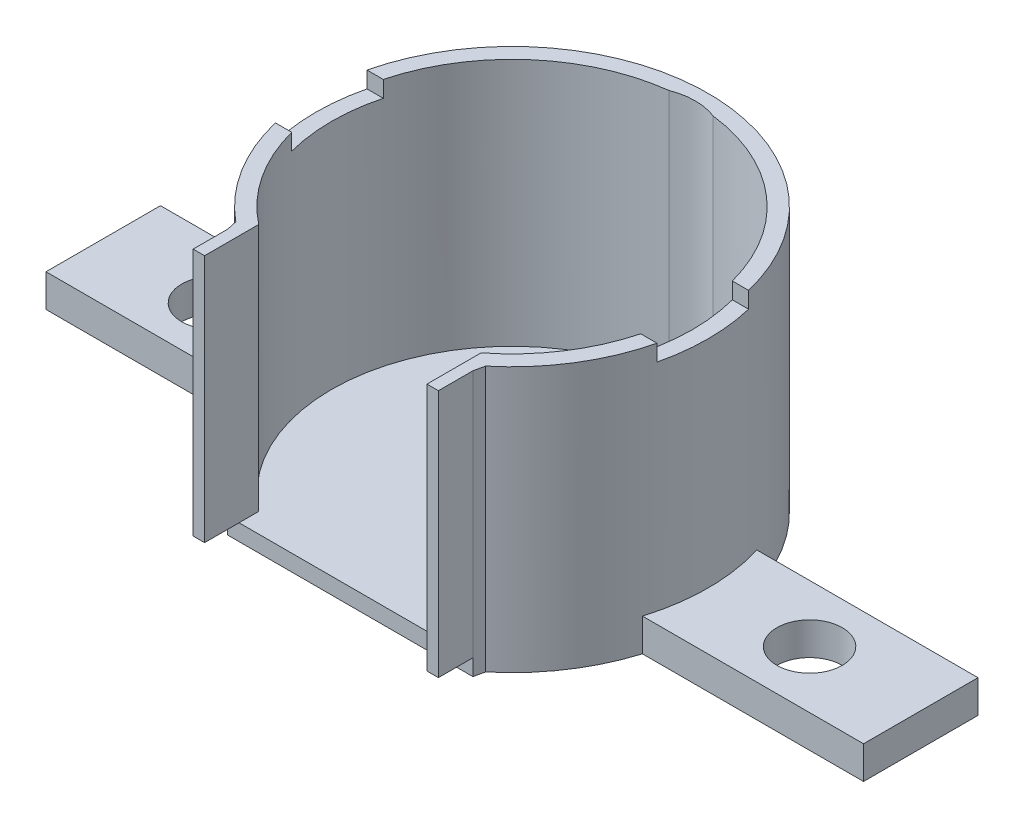
ISO-10303-21;
HEADER;
FILE_DESCRIPTION(('STEP AP214'),'2;1');
FILE_NAME('part.step','',(''),(''),'','','');
FILE_SCHEMA(('AUTOMOTIVE_DESIGN { 1 0 10303 214 1 1 1 1 }'));
ENDSEC;
DATA;
#1=APPLICATION_CONTEXT('core data for automotive mechanical design processes');
#2=APPLICATION_PROTOCOL_DEFINITION('international standard','automotive_design',2000,#1);
#3=PRODUCT_CONTEXT('',#1,'mechanical');
#4=PRODUCT('Part','Part','',(#3));
#5=PRODUCT_RELATED_PRODUCT_CATEGORY('part','',(#4));
#6=PRODUCT_DEFINITION_FORMATION('','',#4);
#7=PRODUCT_DEFINITION_CONTEXT('part definition',#1,'design');
#8=PRODUCT_DEFINITION('design','',#6,#7);
#9=PRODUCT_DEFINITION_SHAPE('','',#8);
#10=(LENGTH_UNIT() NAMED_UNIT(*) SI_UNIT(.MILLI.,.METRE.));
#11=(NAMED_UNIT(*) PLANE_ANGLE_UNIT() SI_UNIT($,.RADIAN.));
#12=(NAMED_UNIT(*) SI_UNIT($,.STERADIAN.) SOLID_ANGLE_UNIT());
#13=UNCERTAINTY_MEASURE_WITH_UNIT(LENGTH_MEASURE(1.E-05),#10,'distance_accuracy_value','');
#14=(GEOMETRIC_REPRESENTATION_CONTEXT(3) GLOBAL_UNCERTAINTY_ASSIGNED_CONTEXT((#13)) GLOBAL_UNIT_ASSIGNED_CONTEXT((#10,
#11,#12)) REPRESENTATION_CONTEXT('',''));
#15=CARTESIAN_POINT('',(0.,0.,0.));
#16=DIRECTION('',(0.,0.,1.));
#17=DIRECTION('',(1.,0.,0.));
#18=AXIS2_PLACEMENT_3D('',#15,#16,#17);
#19=CARTESIAN_POINT('',(0.,19.304,0.));
#20=DIRECTION('',(0.,1.,0.));
#21=DIRECTION('',(0.,0.,1.));
#22=AXIS2_PLACEMENT_3D('',#19,#20,#21);
#23=PLANE('',#22);
#24=DIRECTION('',(1.,0.,0.));
#25=VECTOR('',#24,1.);
#26=CARTESIAN_POINT('',(13.5255,19.304,3.556));
#27=LINE('',#26,#25);
#28=CARTESIAN_POINT('',(13.5557984937258,19.304,3.556));
#29=VERTEX_POINT('',#28);
#30=CARTESIAN_POINT('',(14.8193273801479,19.304,3.556));
#31=VERTEX_POINT('',#30);
#32=EDGE_CURVE('E398',#29,#31,#27,.T.);
#33=ORIENTED_EDGE('',*,*,#32,.F.);
#34=CARTESIAN_POINT('',(0.,19.304,0.));
#35=DIRECTION('',(0.,1.,0.));
#36=DIRECTION('',(0.,0.,1.));
#37=AXIS2_PLACEMENT_3D('',#34,#35,#36);
#38=CIRCLE('',#37,14.01445);
#39=CARTESIAN_POINT('',(8.63599999999999,19.304,11.0374051661838));
#40=VERTEX_POINT('',#39);
#41=EDGE_CURVE('E325',#40,#29,#38,.T.);
#42=ORIENTED_EDGE('',*,*,#41,.F.);
#43=DIRECTION('',(0.,0.,-1.));
#44=VECTOR('',#43,1.);
#45=CARTESIAN_POINT('',(8.636,19.304,15.2409378327274));
#46=LINE('',#45,#44);
#47=CARTESIAN_POINT('',(8.636,19.304,15.2409378327274));
#48=VERTEX_POINT('',#47);
#49=EDGE_CURVE('E570',#48,#40,#46,.T.);
#50=ORIENTED_EDGE('',*,*,#49,.F.);
#51=DIRECTION('',(1.,0.,0.));
#52=VECTOR('',#51,1.);
#53=CARTESIAN_POINT('',(-9.525,19.304,15.2409378327274));
#54=LINE('',#53,#52);
#55=CARTESIAN_POINT('',(9.525,19.304,15.2409378327274));
#56=VERTEX_POINT('',#55);
#57=EDGE_CURVE('E740',#48,#56,#54,.T.);
#58=ORIENTED_EDGE('',*,*,#57,.T.);
#59=DIRECTION('',(0.,0.,-1.));
#60=VECTOR('',#59,1.);
#61=CARTESIAN_POINT('',(9.525,19.304,15.2409378327274));
#62=LINE('',#61,#60);
#63=CARTESIAN_POINT('',(9.525,19.304,12.5631800169447));
#64=VERTEX_POINT('',#63);
#65=EDGE_CURVE('E742',#56,#64,#62,.T.);
#66=ORIENTED_EDGE('',*,*,#65,.T.);
#67=DIRECTION('',(0.213179274775089,0.,-0.977013099608376));
#68=VECTOR('',#67,1.);
#69=CARTESIAN_POINT('',(9.525,19.304,12.5631800169447));
#70=LINE('',#69,#68);
#71=CARTESIAN_POINT('',(9.70177588828793,19.304,11.75300576931));
#72=VERTEX_POINT('',#71);
#73=EDGE_CURVE('E736',#64,#72,#70,.T.);
#74=ORIENTED_EDGE('',*,*,#73,.T.);
#75=CARTESIAN_POINT('',(0.,19.304,0.));
#76=DIRECTION('',(0.,1.,0.));
#77=DIRECTION('',(0.,0.,1.));
#78=AXIS2_PLACEMENT_3D('',#75,#76,#77);
#79=CIRCLE('',#78,15.24);
#80=EDGE_CURVE('E340',#72,#31,#79,.T.);
#81=ORIENTED_EDGE('',*,*,#80,.T.);
#82=EDGE_LOOP('',(#33,#42,#50,#58,#66,#74,#81));
#83=FACE_BOUND('',#82,.T.);
#84=ADVANCED_FACE('F93',(#83),#23,.T.);
#85=DIRECTION('',(1.,0.,0.));
#86=VECTOR('',#85,1.);
#87=CARTESIAN_POINT('',(-13.5255,19.304,3.556));
#88=LINE('',#87,#86);
#89=CARTESIAN_POINT('',(-14.8193273801479,19.304,3.556));
#90=VERTEX_POINT('',#89);
#91=CARTESIAN_POINT('',(-13.5557984937258,19.304,3.556));
#92=VERTEX_POINT('',#91);
#93=EDGE_CURVE('E313',#90,#92,#88,.T.);
#94=ORIENTED_EDGE('',*,*,#93,.F.);
#95=CARTESIAN_POINT('',(-9.70177588828793,19.304,11.75300576931));
#96=VERTEX_POINT('',#95);
#97=EDGE_CURVE('E333',#90,#96,#79,.T.);
#98=ORIENTED_EDGE('',*,*,#97,.T.);
#99=DIRECTION('',(-0.213179274775089,0.,-0.977013099608376));
#100=VECTOR('',#99,1.);
#101=CARTESIAN_POINT('',(-9.525,19.304,12.5631800169447));
#102=LINE('',#101,#100);
#103=CARTESIAN_POINT('',(-9.525,19.304,12.5631800169447));
#104=VERTEX_POINT('',#103);
#105=EDGE_CURVE('E730',#104,#96,#102,.T.);
#106=ORIENTED_EDGE('',*,*,#105,.F.);
#107=DIRECTION('',(0.,0.,1.));
#108=VECTOR('',#107,1.);
#109=CARTESIAN_POINT('',(-9.525,19.304,12.5631800169447));
#110=LINE('',#109,#108);
#111=CARTESIAN_POINT('',(-9.525,19.304,15.2409378327274));
#112=VERTEX_POINT('',#111);
#113=EDGE_CURVE('E735',#104,#112,#110,.T.);
#114=ORIENTED_EDGE('',*,*,#113,.T.);
#115=CARTESIAN_POINT('',(-8.636,19.304,15.2409378327274));
#116=VERTEX_POINT('',#115);
#117=EDGE_CURVE('E745',#112,#116,#54,.T.);
#118=ORIENTED_EDGE('',*,*,#117,.T.);
#119=DIRECTION('',(0.,0.,1.));
#120=VECTOR('',#119,1.);
#121=CARTESIAN_POINT('',(-8.636,19.304,14.01445));
#122=LINE('',#121,#120);
#123=CARTESIAN_POINT('',(-8.636,19.304,11.0374051661838));
#124=VERTEX_POINT('',#123);
#125=EDGE_CURVE('E556',#124,#116,#122,.T.);
#126=ORIENTED_EDGE('',*,*,#125,.F.);
#127=EDGE_CURVE('E323',#92,#124,#38,.T.);
#128=ORIENTED_EDGE('',*,*,#127,.F.);
#129=EDGE_LOOP('',(#94,#98,#106,#114,#118,#126,#128));
#130=FACE_BOUND('',#129,.T.);
#131=ADVANCED_FACE('F640',(#130),#23,.T.);
#132=CARTESIAN_POINT('',(0.,19.304,0.));
#133=DIRECTION('',(0.,-1.,0.));
#134=DIRECTION('',(0.,0.,-1.));
#135=AXIS2_PLACEMENT_3D('',#132,#133,#134);
#136=CYLINDRICAL_SURFACE('',#135,14.01445);
#137=DIRECTION('',(0.,-1.,0.));
#138=VECTOR('',#137,1.);
#139=CARTESIAN_POINT('',(13.5557984937258,19.304,3.556));
#140=LINE('',#139,#138);
#141=CARTESIAN_POINT('',(13.5557984937258,18.034,3.556));
#142=VERTEX_POINT('',#141);
#143=EDGE_CURVE('E423',#142,#29,#140,.F.);
#144=ORIENTED_EDGE('',*,*,#143,.F.);
#145=CARTESIAN_POINT('',(0.,18.034,0.));
#146=DIRECTION('',(0.,-1.,0.));
#147=DIRECTION('',(0.,0.,-1.));
#148=AXIS2_PLACEMENT_3D('',#145,#146,#147);
#149=CIRCLE('',#148,14.01445);
#150=CARTESIAN_POINT('',(13.5557984937258,18.034,-3.556));
#151=VERTEX_POINT('',#150);
#152=EDGE_CURVE('E417',#151,#142,#149,.T.);
#153=ORIENTED_EDGE('',*,*,#152,.F.);
#154=DIRECTION('',(0.,-1.,0.));
#155=VECTOR('',#154,1.);
#156=CARTESIAN_POINT('',(13.5557984937258,19.304,-3.556));
#157=LINE('',#156,#155);
#158=CARTESIAN_POINT('',(13.5557984937258,19.304,-3.556));
#159=VERTEX_POINT('',#158);
#160=EDGE_CURVE('E420',#159,#151,#157,.T.);
#161=ORIENTED_EDGE('',*,*,#160,.F.);
#162=CARTESIAN_POINT('',(1.7170769342723,19.304,-13.9088624841965));
#163=VERTEX_POINT('',#162);
#164=EDGE_CURVE('E322',#159,#163,#38,.T.);
#165=ORIENTED_EDGE('',*,*,#164,.T.);
#166=DIRECTION('',(0.,-1.,0.));
#167=VECTOR('',#166,1.);
#168=CARTESIAN_POINT('',(1.71707693427231,9.652,-13.9088624841965));
#169=LINE('',#168,#167);
#170=CARTESIAN_POINT('',(1.71707693427231,0.,-13.9088624841965));
#171=VERTEX_POINT('',#170);
#172=EDGE_CURVE('E522',#171,#163,#169,.F.);
#173=ORIENTED_EDGE('',*,*,#172,.F.);
#174=CARTESIAN_POINT('',(0.,0.,0.));
#175=DIRECTION('',(0.,1.,0.));
#176=DIRECTION('',(0.,0.,1.));
#177=AXIS2_PLACEMENT_3D('',#174,#175,#176);
#178=CIRCLE('',#177,14.01445);
#179=CARTESIAN_POINT('',(8.63599999999999,0.,11.0374051661838));
#180=VERTEX_POINT('',#179);
#181=EDGE_CURVE('E328',#180,#171,#178,.T.);
#182=ORIENTED_EDGE('',*,*,#181,.F.);
#183=DIRECTION('',(0.,1.,0.));
#184=VECTOR('',#183,1.);
#185=CARTESIAN_POINT('',(8.63599999999999,0.,11.0374051661838));
#186=LINE('',#185,#184);
#187=EDGE_CURVE('E567',#180,#40,#186,.T.);
#188=ORIENTED_EDGE('',*,*,#187,.T.);
#189=ORIENTED_EDGE('',*,*,#41,.T.);
#190=EDGE_LOOP('',(#144,#153,#161,#165,#173,#182,#188,#189));
#191=FACE_BOUND('',#190,.T.);
#192=ADVANCED_FACE('F586',(#191),#136,.F.);
#193=CARTESIAN_POINT('',(0.,0.,0.));
#194=DIRECTION('',(0.,1.,0.));
#195=DIRECTION('',(0.,0.,1.));
#196=AXIS2_PLACEMENT_3D('',#193,#194,#195);
#197=PLANE('',#196);
#198=DIRECTION('',(-1.,0.,0.));
#199=VECTOR('',#198,1.);
#200=CARTESIAN_POINT('',(-9.525,0.,12.5631800169447));
#201=LINE('',#200,#199);
#202=CARTESIAN_POINT('',(9.525,0.,12.5631800169447));
#203=VERTEX_POINT('',#202);
#204=CARTESIAN_POINT('',(8.636,0.,12.5631800169447));
#205=VERTEX_POINT('',#204);
#206=EDGE_CURVE('E532',#203,#205,#201,.T.);
#207=ORIENTED_EDGE('',*,*,#206,.F.);
#208=DIRECTION('',(0.,0.,-1.));
#209=VECTOR('',#208,1.);
#210=CARTESIAN_POINT('',(9.525,0.,15.2409378327274));
#211=LINE('',#210,#209);
#212=CARTESIAN_POINT('',(9.525,0.,15.2409378327274));
#213=VERTEX_POINT('',#212);
#214=EDGE_CURVE('E576',#213,#203,#211,.T.);
#215=ORIENTED_EDGE('',*,*,#214,.F.);
#216=DIRECTION('',(1.,0.,0.));
#217=VECTOR('',#216,1.);
#218=CARTESIAN_POINT('',(-9.525,0.,15.2409378327274));
#219=LINE('',#218,#217);
#220=CARTESIAN_POINT('',(8.63599999999999,0.,15.2409378327274));
#221=VERTEX_POINT('',#220);
#222=EDGE_CURVE('E756',#221,#213,#219,.T.);
#223=ORIENTED_EDGE('',*,*,#222,.F.);
#224=DIRECTION('',(0.,0.,-1.));
#225=VECTOR('',#224,1.);
#226=CARTESIAN_POINT('',(8.636,0.,11.0374051661838));
#227=LINE('',#226,#225);
#228=EDGE_CURVE('E557',#221,#205,#227,.T.);
#229=ORIENTED_EDGE('',*,*,#228,.T.);
#230=EDGE_LOOP('',(#207,#215,#223,#229));
#231=FACE_BOUND('',#230,.T.);
#232=ADVANCED_FACE('F664',(#231),#197,.F.);
#233=CARTESIAN_POINT('',(-8.636,0.,12.5631800169447));
#234=VERTEX_POINT('',#233);
#235=CARTESIAN_POINT('',(-9.525,0.,12.5631800169447));
#236=VERTEX_POINT('',#235);
#237=EDGE_CURVE('E362',#234,#236,#201,.T.);
#238=ORIENTED_EDGE('',*,*,#237,.F.);
#239=DIRECTION('',(0.,0.,1.));
#240=VECTOR('',#239,1.);
#241=CARTESIAN_POINT('',(-8.636,0.,11.0374051661838));
#242=LINE('',#241,#240);
#243=CARTESIAN_POINT('',(-8.636,0.,15.2409378327274));
#244=VERTEX_POINT('',#243);
#245=EDGE_CURVE('E561',#234,#244,#242,.T.);
#246=ORIENTED_EDGE('',*,*,#245,.T.);
#247=CARTESIAN_POINT('',(-9.525,0.,15.2409378327274));
#248=VERTEX_POINT('',#247);
#249=EDGE_CURVE('E757',#248,#244,#219,.T.);
#250=ORIENTED_EDGE('',*,*,#249,.F.);
#251=DIRECTION('',(0.,0.,1.));
#252=VECTOR('',#251,1.);
#253=CARTESIAN_POINT('',(-9.525,0.,12.5631800169447));
#254=LINE('',#253,#252);
#255=EDGE_CURVE('E753',#236,#248,#254,.T.);
#256=ORIENTED_EDGE('',*,*,#255,.F.);
#257=EDGE_LOOP('',(#238,#246,#250,#256));
#258=FACE_BOUND('',#257,.T.);
#259=ADVANCED_FACE('F655',(#258),#197,.F.);
#260=CARTESIAN_POINT('',(-9.525,19.304,15.2409378327274));
#261=DIRECTION('',(0.,0.,-1.));
#262=DIRECTION('',(-1.,0.,0.));
#263=AXIS2_PLACEMENT_3D('',#260,#261,#262);
#264=PLANE('',#263);
#265=ORIENTED_EDGE('',*,*,#57,.F.);
#266=DIRECTION('',(0.,1.,0.));
#267=VECTOR('',#266,1.);
#268=CARTESIAN_POINT('',(8.636,0.,15.2409378327274));
#269=LINE('',#268,#267);
#270=EDGE_CURVE('E573',#221,#48,#269,.T.);
#271=ORIENTED_EDGE('',*,*,#270,.F.);
#272=ORIENTED_EDGE('',*,*,#222,.T.);
#273=DIRECTION('',(0.,-1.,0.));
#274=VECTOR('',#273,1.);
#275=CARTESIAN_POINT('',(9.525,19.304,15.2409378327274));
#276=LINE('',#275,#274);
#277=EDGE_CURVE('E749',#56,#213,#276,.T.);
#278=ORIENTED_EDGE('',*,*,#277,.F.);
#279=EDGE_LOOP('',(#265,#271,#272,#278));
#280=FACE_BOUND('',#279,.T.);
#281=ADVANCED_FACE('F649',(#280),#264,.F.);
#282=DIRECTION('',(-1.,0.,0.));
#283=VECTOR('',#282,1.);
#284=CARTESIAN_POINT('',(13.5255,19.304,-3.556));
#285=LINE('',#284,#283);
#286=CARTESIAN_POINT('',(14.8193273801479,19.304,-3.556));
#287=VERTEX_POINT('',#286);
#288=EDGE_CURVE('E312',#287,#159,#285,.T.);
#289=ORIENTED_EDGE('',*,*,#288,.F.);
#290=CARTESIAN_POINT('',(-14.8193273801479,19.304,-3.556));
#291=VERTEX_POINT('',#290);
#292=EDGE_CURVE('E310',#287,#291,#79,.T.);
#293=ORIENTED_EDGE('',*,*,#292,.T.);
#294=DIRECTION('',(-1.,0.,0.));
#295=VECTOR('',#294,1.);
#296=CARTESIAN_POINT('',(-13.5255,19.304,-3.556));
#297=LINE('',#296,#295);
#298=CARTESIAN_POINT('',(-13.5557984937258,19.304,-3.556));
#299=VERTEX_POINT('',#298);
#300=EDGE_CURVE('E293',#299,#291,#297,.T.);
#301=ORIENTED_EDGE('',*,*,#300,.F.);
#302=CARTESIAN_POINT('',(-1.7170769342723,19.304,-13.9088624841965));
#303=VERTEX_POINT('',#302);
#304=EDGE_CURVE('E308',#303,#299,#38,.T.);
#305=ORIENTED_EDGE('',*,*,#304,.F.);
#306=CARTESIAN_POINT('',(0.,19.304,-9.53481998305529));
#307=DIRECTION('',(0.,-1.,0.));
#308=DIRECTION('',(0.,0.,-1.));
#309=AXIS2_PLACEMENT_3D('',#306,#307,#308);
#310=CIRCLE('',#309,4.699);
#311=EDGE_CURVE('E515',#303,#163,#310,.T.);
#312=ORIENTED_EDGE('',*,*,#311,.T.);
#313=ORIENTED_EDGE('',*,*,#164,.F.);
#314=EDGE_LOOP('',(#289,#293,#301,#305,#312,#313));
#315=FACE_BOUND('',#314,.T.);
#316=ADVANCED_FACE('F306',(#315),#23,.T.);
#317=DIRECTION('',(0.,-1.,0.));
#318=VECTOR('',#317,1.);
#319=CARTESIAN_POINT('',(-13.5557984937258,19.304,3.556));
#320=LINE('',#319,#318);
#321=CARTESIAN_POINT('',(-13.5557984937258,18.034,3.556));
#322=VERTEX_POINT('',#321);
#323=EDGE_CURVE('E299',#92,#322,#320,.T.);
#324=ORIENTED_EDGE('',*,*,#323,.F.);
#325=ORIENTED_EDGE('',*,*,#127,.T.);
#326=DIRECTION('',(0.,1.,0.));
#327=VECTOR('',#326,1.);
#328=CARTESIAN_POINT('',(-8.636,0.,11.0374051661838));
#329=LINE('',#328,#327);
#330=CARTESIAN_POINT('',(-8.636,0.,11.0374051661838));
#331=VERTEX_POINT('',#330);
#332=EDGE_CURVE('E581',#331,#124,#329,.T.);
#333=ORIENTED_EDGE('',*,*,#332,.F.);
#334=CARTESIAN_POINT('',(-1.7170769342723,0.,-13.9088624841965));
#335=VERTEX_POINT('',#334);
#336=EDGE_CURVE('E769',#335,#331,#178,.T.);
#337=ORIENTED_EDGE('',*,*,#336,.F.);
#338=DIRECTION('',(0.,-1.,0.));
#339=VECTOR('',#338,1.);
#340=CARTESIAN_POINT('',(-1.7170769342723,9.652,-13.9088624841965));
#341=LINE('',#340,#339);
#342=EDGE_CURVE('E320',#303,#335,#341,.T.);
#343=ORIENTED_EDGE('',*,*,#342,.F.);
#344=ORIENTED_EDGE('',*,*,#304,.T.);
#345=DIRECTION('',(0.,-1.,0.));
#346=VECTOR('',#345,1.);
#347=CARTESIAN_POINT('',(-13.5557984937258,19.304,-3.556));
#348=LINE('',#347,#346);
#349=CARTESIAN_POINT('',(-13.5557984937258,18.034,-3.556));
#350=VERTEX_POINT('',#349);
#351=EDGE_CURVE('E290',#350,#299,#348,.F.);
#352=ORIENTED_EDGE('',*,*,#351,.F.);
#353=CARTESIAN_POINT('',(0.,18.034,0.));
#354=DIRECTION('',(0.,1.,0.));
#355=DIRECTION('',(0.,0.,1.));
#356=AXIS2_PLACEMENT_3D('',#353,#354,#355);
#357=CIRCLE('',#356,14.01445);
#358=EDGE_CURVE('E300',#350,#322,#357,.T.);
#359=ORIENTED_EDGE('',*,*,#358,.T.);
#360=EDGE_LOOP('',(#324,#325,#333,#337,#343,#344,#352,#359));
#361=FACE_BOUND('',#360,.T.);
#362=ADVANCED_FACE('F317',(#361),#136,.F.);
#363=CARTESIAN_POINT('',(0.,19.304,0.));
#364=DIRECTION('',(0.,-1.,0.));
#365=DIRECTION('',(0.,0.,-1.));
#366=AXIS2_PLACEMENT_3D('',#363,#364,#365);
#367=CYLINDRICAL_SURFACE('',#366,15.24);
#368=CARTESIAN_POINT('',(0.,18.034,0.));
#369=DIRECTION('',(0.,-1.,0.));
#370=DIRECTION('',(0.,0.,-1.));
#371=AXIS2_PLACEMENT_3D('',#368,#369,#370);
#372=CIRCLE('',#371,15.24);
#373=CARTESIAN_POINT('',(14.8193273801479,18.034,-3.556));
#374=VERTEX_POINT('',#373);
#375=CARTESIAN_POINT('',(14.8193273801479,18.034,3.556));
#376=VERTEX_POINT('',#375);
#377=EDGE_CURVE('E384',#374,#376,#372,.T.);
#378=ORIENTED_EDGE('',*,*,#377,.T.);
#379=DIRECTION('',(0.,-1.,0.));
#380=VECTOR('',#379,1.);
#381=CARTESIAN_POINT('',(14.8193273801479,19.304,3.556));
#382=LINE('',#381,#380);
#383=EDGE_CURVE('E12',#376,#31,#382,.F.);
#384=ORIENTED_EDGE('',*,*,#383,.T.);
#385=ORIENTED_EDGE('',*,*,#80,.F.);
#386=DIRECTION('',(0.,-1.,0.));
#387=VECTOR('',#386,1.);
#388=CARTESIAN_POINT('',(9.70177588828793,19.304,11.75300576931));
#389=LINE('',#388,#387);
#390=CARTESIAN_POINT('',(9.70177588828793,-1.27,11.75300576931));
#391=VERTEX_POINT('',#390);
#392=EDGE_CURVE('E356',#391,#72,#389,.F.);
#393=ORIENTED_EDGE('',*,*,#392,.F.);
#394=CARTESIAN_POINT('',(0.,-1.27,0.));
#395=DIRECTION('',(0.,-1.,0.));
#396=DIRECTION('',(0.,0.,-1.));
#397=AXIS2_PLACEMENT_3D('',#394,#395,#396);
#398=CIRCLE('',#397,15.24);
#399=CARTESIAN_POINT('',(14.5773651597262,-1.27,4.445));
#400=VERTEX_POINT('',#399);
#401=EDGE_CURVE('E536',#400,#391,#398,.T.);
#402=ORIENTED_EDGE('',*,*,#401,.F.);
#403=DIRECTION('',(0.,-1.,0.));
#404=VECTOR('',#403,1.);
#405=CARTESIAN_POINT('',(14.5773651597262,19.304,4.445));
#406=LINE('',#405,#404);
#407=CARTESIAN_POINT('',(14.5773651597262,1.27,4.445));
#408=VERTEX_POINT('',#407);
#409=EDGE_CURVE('E506',#400,#408,#406,.F.);
#410=ORIENTED_EDGE('',*,*,#409,.T.);
#411=CARTESIAN_POINT('',(0.,1.27,0.));
#412=DIRECTION('',(0.,-1.,0.));
#413=DIRECTION('',(0.,0.,-1.));
#414=AXIS2_PLACEMENT_3D('',#411,#412,#413);
#415=CIRCLE('',#414,15.24);
#416=CARTESIAN_POINT('',(14.5773651597262,1.27,-4.445));
#417=VERTEX_POINT('',#416);
#418=EDGE_CURVE('E371',#417,#408,#415,.T.);
#419=ORIENTED_EDGE('',*,*,#418,.F.);
#420=DIRECTION('',(0.,-1.,0.));
#421=VECTOR('',#420,1.);
#422=CARTESIAN_POINT('',(14.5773651597262,19.304,-4.445));
#423=LINE('',#422,#421);
#424=CARTESIAN_POINT('',(14.5773651597262,-1.27,-4.445));
#425=VERTEX_POINT('',#424);
#426=EDGE_CURVE('E510',#417,#425,#423,.T.);
#427=ORIENTED_EDGE('',*,*,#426,.T.);
#428=CARTESIAN_POINT('',(-14.5773651597262,-1.27,-4.445));
#429=VERTEX_POINT('',#428);
#430=EDGE_CURVE('E542',#429,#425,#398,.T.);
#431=ORIENTED_EDGE('',*,*,#430,.F.);
#432=DIRECTION('',(0.,-1.,0.));
#433=VECTOR('',#432,1.);
#434=CARTESIAN_POINT('',(-14.5773651597262,19.304,-4.445));
#435=LINE('',#434,#433);
#436=CARTESIAN_POINT('',(-14.5773651597262,1.27,-4.445));
#437=VERTEX_POINT('',#436);
#438=EDGE_CURVE('E462',#429,#437,#435,.F.);
#439=ORIENTED_EDGE('',*,*,#438,.T.);
#440=CARTESIAN_POINT('',(0.,1.27,0.));
#441=DIRECTION('',(0.,-1.,0.));
#442=DIRECTION('',(0.,0.,-1.));
#443=AXIS2_PLACEMENT_3D('',#440,#441,#442);
#444=CIRCLE('',#443,15.24);
#445=CARTESIAN_POINT('',(-14.5773651597262,1.27,4.445));
#446=VERTEX_POINT('',#445);
#447=EDGE_CURVE('E368',#446,#437,#444,.T.);
#448=ORIENTED_EDGE('',*,*,#447,.F.);
#449=DIRECTION('',(0.,-1.,0.));
#450=VECTOR('',#449,1.);
#451=CARTESIAN_POINT('',(-14.5773651597262,19.304,4.445));
#452=LINE('',#451,#450);
#453=CARTESIAN_POINT('',(-14.5773651597262,-1.27,4.445));
#454=VERTEX_POINT('',#453);
#455=EDGE_CURVE('E502',#446,#454,#452,.T.);
#456=ORIENTED_EDGE('',*,*,#455,.T.);
#457=CARTESIAN_POINT('',(-9.70177588828792,-1.27,11.75300576931));
#458=VERTEX_POINT('',#457);
#459=EDGE_CURVE('E537',#458,#454,#398,.T.);
#460=ORIENTED_EDGE('',*,*,#459,.F.);
#461=DIRECTION('',(0.,-1.,0.));
#462=VECTOR('',#461,1.);
#463=CARTESIAN_POINT('',(-9.70177588828793,19.304,11.75300576931));
#464=LINE('',#463,#462);
#465=EDGE_CURVE('E350',#458,#96,#464,.F.);
#466=ORIENTED_EDGE('',*,*,#465,.T.);
#467=ORIENTED_EDGE('',*,*,#97,.F.);
#468=DIRECTION('',(0.,-1.,0.));
#469=VECTOR('',#468,1.);
#470=CARTESIAN_POINT('',(-14.8193273801479,19.304,3.556));
#471=LINE('',#470,#469);
#472=CARTESIAN_POINT('',(-14.8193273801479,18.034,3.556));
#473=VERTEX_POINT('',#472);
#474=EDGE_CURVE('E380',#90,#473,#471,.T.);
#475=ORIENTED_EDGE('',*,*,#474,.T.);
#476=CARTESIAN_POINT('',(0.,18.034,0.));
#477=DIRECTION('',(0.,1.,0.));
#478=DIRECTION('',(0.,0.,1.));
#479=AXIS2_PLACEMENT_3D('',#476,#477,#478);
#480=CIRCLE('',#479,15.24);
#481=CARTESIAN_POINT('',(-14.8193273801479,18.034,-3.556));
#482=VERTEX_POINT('',#481);
#483=EDGE_CURVE('E374',#482,#473,#480,.T.);
#484=ORIENTED_EDGE('',*,*,#483,.F.);
#485=DIRECTION('',(0.,-1.,0.));
#486=VECTOR('',#485,1.);
#487=CARTESIAN_POINT('',(-14.8193273801479,19.304,-3.556));
#488=LINE('',#487,#486);
#489=EDGE_CURVE('E377',#482,#291,#488,.F.);
#490=ORIENTED_EDGE('',*,*,#489,.T.);
#491=ORIENTED_EDGE('',*,*,#292,.F.);
#492=DIRECTION('',(0.,-1.,0.));
#493=VECTOR('',#492,1.);
#494=CARTESIAN_POINT('',(14.8193273801479,19.304,-3.556));
#495=LINE('',#494,#493);
#496=EDGE_CURVE('E102',#287,#374,#495,.T.);
#497=ORIENTED_EDGE('',*,*,#496,.T.);
#498=EDGE_LOOP('',(#378,#384,#385,#393,#402,#410,#419,#427,#431,#439,#448,#456,#460,#466,#467,
#475,#484,#490,#491,#497));
#499=FACE_BOUND('',#498,.T.);
#500=ADVANCED_FACE('F389',(#499),#367,.T.);
#501=CARTESIAN_POINT('',(-9.525,19.304,12.5631800169447));
#502=DIRECTION('',(-0.977013099608376,0.,0.213179274775089));
#503=DIRECTION('',(0.213179274775089,0.,0.977013099608376));
#504=AXIS2_PLACEMENT_3D('',#501,#502,#503);
#505=PLANE('',#504);
#506=ORIENTED_EDGE('',*,*,#465,.F.);
#507=DIRECTION('',(-0.213179274775088,0.,-0.977013099608377));
#508=VECTOR('',#507,1.);
#509=CARTESIAN_POINT('',(-9.525,-1.27,12.5631800169447));
#510=LINE('',#509,#508);
#511=CARTESIAN_POINT('',(-9.525,-1.27,12.5631800169447));
#512=VERTEX_POINT('',#511);
#513=EDGE_CURVE('E531',#512,#458,#510,.T.);
#514=ORIENTED_EDGE('',*,*,#513,.F.);
#515=DIRECTION('',(0.,1.,0.));
#516=VECTOR('',#515,1.);
#517=CARTESIAN_POINT('',(-9.525,-1.27,12.5631800169447));
#518=LINE('',#517,#516);
#519=EDGE_CURVE('E552',#512,#236,#518,.T.);
#520=ORIENTED_EDGE('',*,*,#519,.T.);
#521=DIRECTION('',(0.,-1.,0.));
#522=VECTOR('',#521,1.);
#523=CARTESIAN_POINT('',(-9.525,19.304,12.5631800169447));
#524=LINE('',#523,#522);
#525=EDGE_CURVE('E732',#104,#236,#524,.T.);
#526=ORIENTED_EDGE('',*,*,#525,.F.);
#527=ORIENTED_EDGE('',*,*,#105,.T.);
#528=EDGE_LOOP('',(#506,#514,#520,#526,#527));
#529=FACE_BOUND('',#528,.T.);
#530=ADVANCED_FACE('F676',(#529),#505,.T.);
#531=CARTESIAN_POINT('',(-9.525,19.304,12.5631800169447));
#532=DIRECTION('',(1.,0.,0.));
#533=DIRECTION('',(0.,0.,-1.));
#534=AXIS2_PLACEMENT_3D('',#531,#532,#533);
#535=PLANE('',#534);
#536=ORIENTED_EDGE('',*,*,#255,.T.);
#537=DIRECTION('',(0.,-1.,0.));
#538=VECTOR('',#537,1.);
#539=CARTESIAN_POINT('',(-9.525,19.304,15.2409378327274));
#540=LINE('',#539,#538);
#541=EDGE_CURVE('E763',#112,#248,#540,.T.);
#542=ORIENTED_EDGE('',*,*,#541,.F.);
#543=ORIENTED_EDGE('',*,*,#113,.F.);
#544=ORIENTED_EDGE('',*,*,#525,.T.);
#545=EDGE_LOOP('',(#536,#542,#543,#544));
#546=FACE_BOUND('',#545,.T.);
#547=ADVANCED_FACE('F668',(#546),#535,.F.);
#548=ORIENTED_EDGE('',*,*,#249,.T.);
#549=DIRECTION('',(0.,1.,0.));
#550=VECTOR('',#549,1.);
#551=CARTESIAN_POINT('',(-8.636,0.,15.2409378327274));
#552=LINE('',#551,#550);
#553=EDGE_CURVE('E577',#244,#116,#552,.T.);
#554=ORIENTED_EDGE('',*,*,#553,.T.);
#555=ORIENTED_EDGE('',*,*,#117,.F.);
#556=ORIENTED_EDGE('',*,*,#541,.T.);
#557=EDGE_LOOP('',(#548,#554,#555,#556));
#558=FACE_BOUND('',#557,.T.);
#559=ADVANCED_FACE('F658',(#558),#264,.F.);
#560=CARTESIAN_POINT('',(9.525,19.304,15.2409378327274));
#561=DIRECTION('',(-1.,0.,0.));
#562=DIRECTION('',(0.,0.,1.));
#563=AXIS2_PLACEMENT_3D('',#560,#561,#562);
#564=PLANE('',#563);
#565=ORIENTED_EDGE('',*,*,#214,.T.);
#566=DIRECTION('',(0.,-1.,0.));
#567=VECTOR('',#566,1.);
#568=CARTESIAN_POINT('',(9.525,19.304,12.5631800169447));
#569=LINE('',#568,#567);
#570=EDGE_CURVE('E365',#64,#203,#569,.T.);
#571=ORIENTED_EDGE('',*,*,#570,.F.);
#572=ORIENTED_EDGE('',*,*,#65,.F.);
#573=ORIENTED_EDGE('',*,*,#277,.T.);
#574=EDGE_LOOP('',(#565,#571,#572,#573));
#575=FACE_BOUND('',#574,.T.);
#576=ADVANCED_FACE('F95',(#575),#564,.F.);
#577=CARTESIAN_POINT('',(9.525,19.304,12.5631800169447));
#578=DIRECTION('',(-0.977013099608376,0.,-0.213179274775089));
#579=DIRECTION('',(-0.213179274775089,0.,0.977013099608376));
#580=AXIS2_PLACEMENT_3D('',#577,#578,#579);
#581=PLANE('',#580);
#582=ORIENTED_EDGE('',*,*,#570,.T.);
#583=DIRECTION('',(0.,1.,0.));
#584=VECTOR('',#583,1.);
#585=CARTESIAN_POINT('',(9.525,-1.27,12.5631800169447));
#586=LINE('',#585,#584);
#587=CARTESIAN_POINT('',(9.525,-1.27,12.5631800169447));
#588=VERTEX_POINT('',#587);
#589=EDGE_CURVE('E545',#588,#203,#586,.T.);
#590=ORIENTED_EDGE('',*,*,#589,.F.);
#591=DIRECTION('',(-0.213179274775089,0.,0.977013099608376));
#592=VECTOR('',#591,1.);
#593=CARTESIAN_POINT('',(9.525,-1.27,12.5631800169447));
#594=LINE('',#593,#592);
#595=EDGE_CURVE('E541',#391,#588,#594,.T.);
#596=ORIENTED_EDGE('',*,*,#595,.F.);
#597=ORIENTED_EDGE('',*,*,#392,.T.);
#598=ORIENTED_EDGE('',*,*,#73,.F.);
#599=EDGE_LOOP('',(#582,#590,#596,#597,#598));
#600=FACE_BOUND('',#599,.T.);
#601=ADVANCED_FACE('F601',(#600),#581,.F.);
#602=CARTESIAN_POINT('',(-8.636,0.,14.01445));
#603=DIRECTION('',(-1.,0.,0.));
#604=DIRECTION('',(0.,0.,1.));
#605=AXIS2_PLACEMENT_3D('',#602,#603,#604);
#606=PLANE('',#605);
#607=ORIENTED_EDGE('',*,*,#125,.T.);
#608=ORIENTED_EDGE('',*,*,#553,.F.);
#609=ORIENTED_EDGE('',*,*,#245,.F.);
#610=EDGE_CURVE('E563',#331,#234,#242,.T.);
#611=ORIENTED_EDGE('',*,*,#610,.F.);
#612=ORIENTED_EDGE('',*,*,#332,.T.);
#613=EDGE_LOOP('',(#607,#608,#609,#611,#612));
#614=FACE_BOUND('',#613,.T.);
#615=ADVANCED_FACE('F670',(#614),#606,.F.);
#616=CARTESIAN_POINT('',(8.636,0.,15.2409378327274));
#617=DIRECTION('',(1.,0.,0.));
#618=DIRECTION('',(0.,0.,-1.));
#619=AXIS2_PLACEMENT_3D('',#616,#617,#618);
#620=PLANE('',#619);
#621=ORIENTED_EDGE('',*,*,#49,.T.);
#622=ORIENTED_EDGE('',*,*,#187,.F.);
#623=EDGE_CURVE('E562',#205,#180,#227,.T.);
#624=ORIENTED_EDGE('',*,*,#623,.F.);
#625=ORIENTED_EDGE('',*,*,#228,.F.);
#626=ORIENTED_EDGE('',*,*,#270,.T.);
#627=EDGE_LOOP('',(#621,#622,#624,#625,#626));
#628=FACE_BOUND('',#627,.T.);
#629=ADVANCED_FACE('F680',(#628),#620,.F.);
#630=CARTESIAN_POINT('',(0.,0.,0.));
#631=DIRECTION('',(0.,-1.,0.));
#632=DIRECTION('',(0.,0.,-1.));
#633=AXIS2_PLACEMENT_3D('',#630,#631,#632);
#634=PLANE('',#633);
#635=ORIENTED_EDGE('',*,*,#181,.T.);
#636=CARTESIAN_POINT('',(0.,0.,-9.53481998305529));
#637=DIRECTION('',(0.,-1.,0.));
#638=DIRECTION('',(0.,0.,-1.));
#639=AXIS2_PLACEMENT_3D('',#636,#637,#638);
#640=CIRCLE('',#639,4.699);
#641=EDGE_CURVE('E514',#335,#171,#640,.T.);
#642=ORIENTED_EDGE('',*,*,#641,.F.);
#643=ORIENTED_EDGE('',*,*,#336,.T.);
#644=ORIENTED_EDGE('',*,*,#610,.T.);
#645=EDGE_CURVE('E526',#205,#234,#201,.T.);
#646=ORIENTED_EDGE('',*,*,#645,.F.);
#647=ORIENTED_EDGE('',*,*,#623,.T.);
#648=EDGE_LOOP('',(#635,#642,#643,#644,#646,#647));
#649=FACE_BOUND('',#648,.T.);
#650=ADVANCED_FACE('F687',(#649),#634,.F.);
#651=CARTESIAN_POINT('',(-9.525,-1.27,12.5631800169447));
#652=DIRECTION('',(0.,0.,-1.));
#653=DIRECTION('',(-1.,0.,0.));
#654=AXIS2_PLACEMENT_3D('',#651,#652,#653);
#655=PLANE('',#654);
#656=ORIENTED_EDGE('',*,*,#206,.T.);
#657=ORIENTED_EDGE('',*,*,#645,.T.);
#658=ORIENTED_EDGE('',*,*,#237,.T.);
#659=ORIENTED_EDGE('',*,*,#519,.F.);
#660=DIRECTION('',(-1.,0.,0.));
#661=VECTOR('',#660,1.);
#662=CARTESIAN_POINT('',(-9.525,-1.27,12.5631800169447));
#663=LINE('',#662,#661);
#664=EDGE_CURVE('E527',#588,#512,#663,.T.);
#665=ORIENTED_EDGE('',*,*,#664,.F.);
#666=ORIENTED_EDGE('',*,*,#589,.T.);
#667=EDGE_LOOP('',(#656,#657,#658,#659,#665,#666));
#668=FACE_BOUND('',#667,.T.);
#669=ADVANCED_FACE('F690',(#668),#655,.F.);
#670=CARTESIAN_POINT('',(0.,-1.27,0.));
#671=DIRECTION('',(0.,-1.,0.));
#672=DIRECTION('',(0.,0.,-1.));
#673=AXIS2_PLACEMENT_3D('',#670,#671,#672);
#674=PLANE('',#673);
#675=ORIENTED_EDGE('',*,*,#430,.T.);
#676=DIRECTION('',(1.,0.,0.));
#677=VECTOR('',#676,1.);
#678=CARTESIAN_POINT('',(14.478,-1.27,-4.445));
#679=LINE('',#678,#677);
#680=CARTESIAN_POINT('',(31.75,-1.27,-4.445));
#681=VERTEX_POINT('',#680);
#682=EDGE_CURVE('E442',#425,#681,#679,.T.);
#683=ORIENTED_EDGE('',*,*,#682,.T.);
#684=DIRECTION('',(0.,0.,1.));
#685=VECTOR('',#684,1.);
#686=CARTESIAN_POINT('',(31.75,-1.27,4.445));
#687=LINE('',#686,#685);
#688=CARTESIAN_POINT('',(31.75,-1.27,4.445));
#689=VERTEX_POINT('',#688);
#690=EDGE_CURVE('E431',#681,#689,#687,.T.);
#691=ORIENTED_EDGE('',*,*,#690,.T.);
#692=DIRECTION('',(-1.,0.,0.));
#693=VECTOR('',#692,1.);
#694=CARTESIAN_POINT('',(14.478,-1.27,4.445));
#695=LINE('',#694,#693);
#696=EDGE_CURVE('E453',#689,#400,#695,.T.);
#697=ORIENTED_EDGE('',*,*,#696,.T.);
#698=ORIENTED_EDGE('',*,*,#401,.T.);
#699=ORIENTED_EDGE('',*,*,#595,.T.);
#700=ORIENTED_EDGE('',*,*,#664,.T.);
#701=ORIENTED_EDGE('',*,*,#513,.T.);
#702=ORIENTED_EDGE('',*,*,#459,.T.);
#703=DIRECTION('',(-1.,0.,0.));
#704=VECTOR('',#703,1.);
#705=CARTESIAN_POINT('',(-14.478,-1.27,4.445));
#706=LINE('',#705,#704);
#707=CARTESIAN_POINT('',(-31.75,-1.27,4.445));
#708=VERTEX_POINT('',#707);
#709=EDGE_CURVE('E480',#454,#708,#706,.T.);
#710=ORIENTED_EDGE('',*,*,#709,.T.);
#711=DIRECTION('',(0.,0.,-1.));
#712=VECTOR('',#711,1.);
#713=CARTESIAN_POINT('',(-31.75,-1.27,4.445));
#714=LINE('',#713,#712);
#715=CARTESIAN_POINT('',(-31.75,-1.27,-4.445));
#716=VERTEX_POINT('',#715);
#717=EDGE_CURVE('E475',#708,#716,#714,.T.);
#718=ORIENTED_EDGE('',*,*,#717,.T.);
#719=DIRECTION('',(1.,0.,0.));
#720=VECTOR('',#719,1.);
#721=CARTESIAN_POINT('',(-14.478,-1.27,-4.445));
#722=LINE('',#721,#720);
#723=EDGE_CURVE('E472',#716,#429,#722,.T.);
#724=ORIENTED_EDGE('',*,*,#723,.T.);
#725=EDGE_LOOP('',(#675,#683,#691,#697,#698,#699,#700,#701,#702,#710,#718,#724));
#726=FACE_BOUND('',#725,.T.);
#727=CARTESIAN_POINT('',(-23.114,-1.27,0.));
#728=DIRECTION('',(0.,-1.,0.));
#729=DIRECTION('',(0.,0.,1.));
#730=AXIS2_PLACEMENT_3D('',#727,#728,#729);
#731=CIRCLE('',#730,2.54);
#732=CARTESIAN_POINT('',(-23.114,-1.27,2.54));
#733=VERTEX_POINT('',#732);
#734=EDGE_CURVE('E436',#733,#733,#731,.T.);
#735=ORIENTED_EDGE('',*,*,#734,.F.);
#736=EDGE_LOOP('',(#735));
#737=FACE_BOUND('',#736,.T.);
#738=CARTESIAN_POINT('',(23.114,-1.27,0.));
#739=DIRECTION('',(0.,-1.,0.));
#740=DIRECTION('',(0.,0.,-1.));
#741=AXIS2_PLACEMENT_3D('',#738,#739,#740);
#742=CIRCLE('',#741,2.54);
#743=CARTESIAN_POINT('',(23.114,-1.27,-2.54));
#744=VERTEX_POINT('',#743);
#745=EDGE_CURVE('E432',#744,#744,#742,.T.);
#746=ORIENTED_EDGE('',*,*,#745,.F.);
#747=EDGE_LOOP('',(#746));
#748=FACE_BOUND('',#747,.T.);
#749=ADVANCED_FACE('F605',(#726,#737,#748),#674,.T.);
#750=CARTESIAN_POINT('',(0.,19.304,-9.53481998305529));
#751=DIRECTION('',(0.,-1.,0.));
#752=DIRECTION('',(0.,0.,-1.));
#753=AXIS2_PLACEMENT_3D('',#750,#751,#752);
#754=CYLINDRICAL_SURFACE('',#753,4.699);
#755=ORIENTED_EDGE('',*,*,#172,.T.);
#756=ORIENTED_EDGE('',*,*,#311,.F.);
#757=ORIENTED_EDGE('',*,*,#342,.T.);
#758=ORIENTED_EDGE('',*,*,#641,.T.);
#759=EDGE_LOOP('',(#755,#756,#757,#758));
#760=FACE_BOUND('',#759,.T.);
#761=ADVANCED_FACE('F699',(#760),#754,.F.);
#762=CARTESIAN_POINT('',(-14.478,1.27,4.445));
#763=DIRECTION('',(0.,0.,1.));
#764=DIRECTION('',(1.,0.,0.));
#765=AXIS2_PLACEMENT_3D('',#762,#763,#764);
#766=PLANE('',#765);
#767=ORIENTED_EDGE('',*,*,#455,.F.);
#768=DIRECTION('',(-1.,0.,0.));
#769=VECTOR('',#768,1.);
#770=CARTESIAN_POINT('',(-14.478,1.27,4.445));
#771=LINE('',#770,#769);
#772=CARTESIAN_POINT('',(-31.75,1.27,4.445));
#773=VERTEX_POINT('',#772);
#774=EDGE_CURVE('E476',#446,#773,#771,.T.);
#775=ORIENTED_EDGE('',*,*,#774,.T.);
#776=DIRECTION('',(0.,-1.,0.));
#777=VECTOR('',#776,1.);
#778=CARTESIAN_POINT('',(-31.75,1.27,4.445));
#779=LINE('',#778,#777);
#780=EDGE_CURVE('E465',#773,#708,#779,.T.);
#781=ORIENTED_EDGE('',*,*,#780,.T.);
#782=ORIENTED_EDGE('',*,*,#709,.F.);
#783=EDGE_LOOP('',(#767,#775,#781,#782));
#784=FACE_BOUND('',#783,.T.);
#785=ADVANCED_FACE('F702',(#784),#766,.T.);
#786=CARTESIAN_POINT('',(-14.478,1.27,-4.445));
#787=DIRECTION('',(0.,0.,-1.));
#788=DIRECTION('',(-1.,0.,0.));
#789=AXIS2_PLACEMENT_3D('',#786,#787,#788);
#790=PLANE('',#789);
#791=ORIENTED_EDGE('',*,*,#438,.F.);
#792=ORIENTED_EDGE('',*,*,#723,.F.);
#793=DIRECTION('',(0.,-1.,0.));
#794=VECTOR('',#793,1.);
#795=CARTESIAN_POINT('',(-31.75,1.27,-4.445));
#796=LINE('',#795,#794);
#797=CARTESIAN_POINT('',(-31.75,1.27,-4.445));
#798=VERTEX_POINT('',#797);
#799=EDGE_CURVE('E426',#798,#716,#796,.T.);
#800=ORIENTED_EDGE('',*,*,#799,.F.);
#801=DIRECTION('',(1.,0.,0.));
#802=VECTOR('',#801,1.);
#803=CARTESIAN_POINT('',(-14.478,1.27,-4.445));
#804=LINE('',#803,#802);
#805=EDGE_CURVE('E469',#798,#437,#804,.T.);
#806=ORIENTED_EDGE('',*,*,#805,.T.);
#807=EDGE_LOOP('',(#791,#792,#800,#806));
#808=FACE_BOUND('',#807,.T.);
#809=ADVANCED_FACE('F712',(#808),#790,.T.);
#810=CARTESIAN_POINT('',(-31.75,1.27,4.445));
#811=DIRECTION('',(-1.,0.,0.));
#812=DIRECTION('',(0.,0.,1.));
#813=AXIS2_PLACEMENT_3D('',#810,#811,#812);
#814=PLANE('',#813);
#815=ORIENTED_EDGE('',*,*,#717,.F.);
#816=ORIENTED_EDGE('',*,*,#780,.F.);
#817=DIRECTION('',(0.,0.,-1.));
#818=VECTOR('',#817,1.);
#819=CARTESIAN_POINT('',(-31.75,1.27,4.445));
#820=LINE('',#819,#818);
#821=EDGE_CURVE('E487',#773,#798,#820,.T.);
#822=ORIENTED_EDGE('',*,*,#821,.T.);
#823=ORIENTED_EDGE('',*,*,#799,.T.);
#824=EDGE_LOOP('',(#815,#816,#822,#823));
#825=FACE_BOUND('',#824,.T.);
#826=ADVANCED_FACE('F710',(#825),#814,.T.);
#827=CARTESIAN_POINT('',(0.,1.27,0.));
#828=DIRECTION('',(0.,-1.,0.));
#829=DIRECTION('',(0.,0.,-1.));
#830=AXIS2_PLACEMENT_3D('',#827,#828,#829);
#831=PLANE('',#830);
#832=CARTESIAN_POINT('',(-23.114,1.27,0.));
#833=DIRECTION('',(0.,-1.,0.));
#834=DIRECTION('',(0.,0.,1.));
#835=AXIS2_PLACEMENT_3D('',#832,#833,#834);
#836=CIRCLE('',#835,2.54);
#837=CARTESIAN_POINT('',(-23.114,1.27,2.54));
#838=VERTEX_POINT('',#837);
#839=EDGE_CURVE('E483',#838,#838,#836,.T.);
#840=ORIENTED_EDGE('',*,*,#839,.T.);
#841=EDGE_LOOP('',(#840));
#842=FACE_BOUND('',#841,.T.);
#843=ORIENTED_EDGE('',*,*,#774,.F.);
#844=ORIENTED_EDGE('',*,*,#447,.T.);
#845=ORIENTED_EDGE('',*,*,#805,.F.);
#846=ORIENTED_EDGE('',*,*,#821,.F.);
#847=EDGE_LOOP('',(#843,#844,#845,#846));
#848=FACE_BOUND('',#847,.T.);
#849=ADVANCED_FACE('F706',(#842,#848),#831,.F.);
#850=CARTESIAN_POINT('',(-23.114,1.27,0.));
#851=DIRECTION('',(0.,-1.,0.));
#852=DIRECTION('',(0.,0.,-1.));
#853=AXIS2_PLACEMENT_3D('',#850,#851,#852);
#854=CYLINDRICAL_SURFACE('',#853,2.54);
#855=ORIENTED_EDGE('',*,*,#839,.F.);
#856=EDGE_LOOP('',(#855));
#857=FACE_BOUND('',#856,.T.);
#858=ORIENTED_EDGE('',*,*,#734,.T.);
#859=EDGE_LOOP('',(#858));
#860=FACE_BOUND('',#859,.T.);
#861=ADVANCED_FACE('F637',(#857,#860),#854,.F.);
#862=CARTESIAN_POINT('',(14.478,1.27,-4.445));
#863=DIRECTION('',(0.,0.,-1.));
#864=DIRECTION('',(-1.,0.,0.));
#865=AXIS2_PLACEMENT_3D('',#862,#863,#864);
#866=PLANE('',#865);
#867=ORIENTED_EDGE('',*,*,#426,.F.);
#868=DIRECTION('',(1.,0.,0.));
#869=VECTOR('',#868,1.);
#870=CARTESIAN_POINT('',(14.478,1.27,-4.445));
#871=LINE('',#870,#869);
#872=CARTESIAN_POINT('',(31.75,1.27,-4.445));
#873=VERTEX_POINT('',#872);
#874=EDGE_CURVE('E446',#417,#873,#871,.T.);
#875=ORIENTED_EDGE('',*,*,#874,.T.);
#876=DIRECTION('',(0.,-1.,0.));
#877=VECTOR('',#876,1.);
#878=CARTESIAN_POINT('',(31.75,1.27,-4.445));
#879=LINE('',#878,#877);
#880=EDGE_CURVE('E458',#873,#681,#879,.T.);
#881=ORIENTED_EDGE('',*,*,#880,.T.);
#882=ORIENTED_EDGE('',*,*,#682,.F.);
#883=EDGE_LOOP('',(#867,#875,#881,#882));
#884=FACE_BOUND('',#883,.T.);
#885=ADVANCED_FACE('F619',(#884),#866,.T.);
#886=CARTESIAN_POINT('',(14.478,1.27,4.445));
#887=DIRECTION('',(0.,0.,1.));
#888=DIRECTION('',(1.,0.,0.));
#889=AXIS2_PLACEMENT_3D('',#886,#887,#888);
#890=PLANE('',#889);
#891=ORIENTED_EDGE('',*,*,#409,.F.);
#892=ORIENTED_EDGE('',*,*,#696,.F.);
#893=DIRECTION('',(0.,-1.,0.));
#894=VECTOR('',#893,1.);
#895=CARTESIAN_POINT('',(31.75,1.27,4.445));
#896=LINE('',#895,#894);
#897=CARTESIAN_POINT('',(31.75,1.27,4.445));
#898=VERTEX_POINT('',#897);
#899=EDGE_CURVE('E449',#898,#689,#896,.T.);
#900=ORIENTED_EDGE('',*,*,#899,.F.);
#901=DIRECTION('',(-1.,0.,0.));
#902=VECTOR('',#901,1.);
#903=CARTESIAN_POINT('',(14.478,1.27,4.445));
#904=LINE('',#903,#902);
#905=EDGE_CURVE('E441',#898,#408,#904,.T.);
#906=ORIENTED_EDGE('',*,*,#905,.T.);
#907=EDGE_LOOP('',(#891,#892,#900,#906));
#908=FACE_BOUND('',#907,.T.);
#909=ADVANCED_FACE('F629',(#908),#890,.T.);
#910=CARTESIAN_POINT('',(31.75,1.27,4.445));
#911=DIRECTION('',(1.,0.,0.));
#912=DIRECTION('',(0.,0.,-1.));
#913=AXIS2_PLACEMENT_3D('',#910,#911,#912);
#914=PLANE('',#913);
#915=ORIENTED_EDGE('',*,*,#690,.F.);
#916=ORIENTED_EDGE('',*,*,#880,.F.);
#917=DIRECTION('',(0.,0.,1.));
#918=VECTOR('',#917,1.);
#919=CARTESIAN_POINT('',(31.75,1.27,4.445));
#920=LINE('',#919,#918);
#921=EDGE_CURVE('E437',#873,#898,#920,.T.);
#922=ORIENTED_EDGE('',*,*,#921,.T.);
#923=ORIENTED_EDGE('',*,*,#899,.T.);
#924=EDGE_LOOP('',(#915,#916,#922,#923));
#925=FACE_BOUND('',#924,.T.);
#926=ADVANCED_FACE('F627',(#925),#914,.T.);
#927=CARTESIAN_POINT('',(0.,1.27,0.));
#928=DIRECTION('',(0.,-1.,0.));
#929=DIRECTION('',(0.,0.,-1.));
#930=AXIS2_PLACEMENT_3D('',#927,#928,#929);
#931=PLANE('',#930);
#932=CARTESIAN_POINT('',(23.114,1.27,0.));
#933=DIRECTION('',(0.,-1.,0.));
#934=DIRECTION('',(0.,0.,-1.));
#935=AXIS2_PLACEMENT_3D('',#932,#933,#934);
#936=CIRCLE('',#935,2.54);
#937=CARTESIAN_POINT('',(23.114,1.27,-2.54));
#938=VERTEX_POINT('',#937);
#939=EDGE_CURVE('E427',#938,#938,#936,.T.);
#940=ORIENTED_EDGE('',*,*,#939,.T.);
#941=EDGE_LOOP('',(#940));
#942=FACE_BOUND('',#941,.T.);
#943=ORIENTED_EDGE('',*,*,#874,.F.);
#944=ORIENTED_EDGE('',*,*,#418,.T.);
#945=ORIENTED_EDGE('',*,*,#905,.F.);
#946=ORIENTED_EDGE('',*,*,#921,.F.);
#947=EDGE_LOOP('',(#943,#944,#945,#946));
#948=FACE_BOUND('',#947,.T.);
#949=ADVANCED_FACE('F623',(#942,#948),#931,.F.);
#950=CARTESIAN_POINT('',(23.114,1.27,0.));
#951=DIRECTION('',(0.,-1.,0.));
#952=DIRECTION('',(0.,0.,-1.));
#953=AXIS2_PLACEMENT_3D('',#950,#951,#952);
#954=CYLINDRICAL_SURFACE('',#953,2.54);
#955=ORIENTED_EDGE('',*,*,#939,.F.);
#956=EDGE_LOOP('',(#955));
#957=FACE_BOUND('',#956,.T.);
#958=ORIENTED_EDGE('',*,*,#745,.T.);
#959=EDGE_LOOP('',(#958));
#960=FACE_BOUND('',#959,.T.);
#961=ADVANCED_FACE('F807',(#957,#960),#954,.F.);
#962=CARTESIAN_POINT('',(-13.5255,18.034,3.556));
#963=DIRECTION('',(0.,0.,1.));
#964=DIRECTION('',(1.,0.,0.));
#965=AXIS2_PLACEMENT_3D('',#962,#963,#964);
#966=PLANE('',#965);
#967=ORIENTED_EDGE('',*,*,#323,.T.);
#968=DIRECTION('',(1.,0.,0.));
#969=VECTOR('',#968,1.);
#970=CARTESIAN_POINT('',(-13.5255,18.034,3.556));
#971=LINE('',#970,#969);
#972=EDGE_CURVE('E407',#473,#322,#971,.T.);
#973=ORIENTED_EDGE('',*,*,#972,.F.);
#974=ORIENTED_EDGE('',*,*,#474,.F.);
#975=ORIENTED_EDGE('',*,*,#93,.T.);
#976=EDGE_LOOP('',(#967,#973,#974,#975));
#977=FACE_BOUND('',#976,.T.);
#978=ADVANCED_FACE('F804',(#977),#966,.F.);
#979=CARTESIAN_POINT('',(-13.5255,18.034,-3.556));
#980=DIRECTION('',(0.,0.,-1.));
#981=DIRECTION('',(-1.,0.,0.));
#982=AXIS2_PLACEMENT_3D('',#979,#980,#981);
#983=PLANE('',#982);
#984=ORIENTED_EDGE('',*,*,#351,.T.);
#985=ORIENTED_EDGE('',*,*,#300,.T.);
#986=ORIENTED_EDGE('',*,*,#489,.F.);
#987=DIRECTION('',(-1.,0.,0.));
#988=VECTOR('',#987,1.);
#989=CARTESIAN_POINT('',(-13.5255,18.034,-3.556));
#990=LINE('',#989,#988);
#991=EDGE_CURVE('E117',#350,#482,#990,.T.);
#992=ORIENTED_EDGE('',*,*,#991,.F.);
#993=EDGE_LOOP('',(#984,#985,#986,#992));
#994=FACE_BOUND('',#993,.T.);
#995=ADVANCED_FACE('F292',(#994),#983,.F.);
#996=CARTESIAN_POINT('',(0.,18.034,0.));
#997=DIRECTION('',(0.,1.,0.));
#998=DIRECTION('',(0.,0.,1.));
#999=AXIS2_PLACEMENT_3D('',#996,#997,#998);
#1000=PLANE('',#999);
#1001=ORIENTED_EDGE('',*,*,#991,.T.);
#1002=ORIENTED_EDGE('',*,*,#483,.T.);
#1003=ORIENTED_EDGE('',*,*,#972,.T.);
#1004=ORIENTED_EDGE('',*,*,#358,.F.);
#1005=EDGE_LOOP('',(#1001,#1002,#1003,#1004));
#1006=FACE_BOUND('',#1005,.T.);
#1007=ADVANCED_FACE('F800',(#1006),#1000,.T.);
#1008=CARTESIAN_POINT('',(13.5255,18.034,3.556));
#1009=DIRECTION('',(0.,0.,1.));
#1010=DIRECTION('',(1.,0.,0.));
#1011=AXIS2_PLACEMENT_3D('',#1008,#1009,#1010);
#1012=PLANE('',#1011);
#1013=ORIENTED_EDGE('',*,*,#143,.T.);
#1014=ORIENTED_EDGE('',*,*,#32,.T.);
#1015=ORIENTED_EDGE('',*,*,#383,.F.);
#1016=DIRECTION('',(1.,0.,0.));
#1017=VECTOR('',#1016,1.);
#1018=CARTESIAN_POINT('',(13.5255,18.034,3.556));
#1019=LINE('',#1018,#1017);
#1020=EDGE_CURVE('E109',#142,#376,#1019,.T.);
#1021=ORIENTED_EDGE('',*,*,#1020,.F.);
#1022=EDGE_LOOP('',(#1013,#1014,#1015,#1021));
#1023=FACE_BOUND('',#1022,.T.);
#1024=ADVANCED_FACE('F594',(#1023),#1012,.F.);
#1025=CARTESIAN_POINT('',(13.5255,18.034,-3.556));
#1026=DIRECTION('',(0.,0.,-1.));
#1027=DIRECTION('',(-1.,0.,0.));
#1028=AXIS2_PLACEMENT_3D('',#1025,#1026,#1027);
#1029=PLANE('',#1028);
#1030=ORIENTED_EDGE('',*,*,#160,.T.);
#1031=DIRECTION('',(-1.,0.,0.));
#1032=VECTOR('',#1031,1.);
#1033=CARTESIAN_POINT('',(13.5255,18.034,-3.556));
#1034=LINE('',#1033,#1032);
#1035=EDGE_CURVE('E395',#374,#151,#1034,.T.);
#1036=ORIENTED_EDGE('',*,*,#1035,.F.);
#1037=ORIENTED_EDGE('',*,*,#496,.F.);
#1038=ORIENTED_EDGE('',*,*,#288,.T.);
#1039=EDGE_LOOP('',(#1030,#1036,#1037,#1038));
#1040=FACE_BOUND('',#1039,.T.);
#1041=ADVANCED_FACE('F392',(#1040),#1029,.F.);
#1042=CARTESIAN_POINT('',(0.,18.034,0.));
#1043=DIRECTION('',(0.,-1.,0.));
#1044=DIRECTION('',(0.,0.,-1.));
#1045=AXIS2_PLACEMENT_3D('',#1042,#1043,#1044);
#1046=PLANE('',#1045);
#1047=ORIENTED_EDGE('',*,*,#152,.T.);
#1048=ORIENTED_EDGE('',*,*,#1020,.T.);
#1049=ORIENTED_EDGE('',*,*,#377,.F.);
#1050=ORIENTED_EDGE('',*,*,#1035,.T.);
#1051=EDGE_LOOP('',(#1047,#1048,#1049,#1050));
#1052=FACE_BOUND('',#1051,.T.);
#1053=ADVANCED_FACE('F791',(#1052),#1046,.F.);
#1054=CLOSED_SHELL('',(#84,#131,#192,#232,#259,#281,#316,#362,#500,#530,#547,#559,#576,#601,
#615,#629,#650,#669,#749,#761,#785,#809,#826,#849,#861,#885,#909,#926,#949,#961,#978,#995,#1007,
#1024,#1041,#1053));
#1055=MANIFOLD_SOLID_BREP('B2',#1054);
#1056=ADVANCED_BREP_SHAPE_REPRESENTATION('',(#18,#1055),#14);
#1057=SHAPE_DEFINITION_REPRESENTATION(#9,#1056);
ENDSEC;
END-ISO-10303-21;
